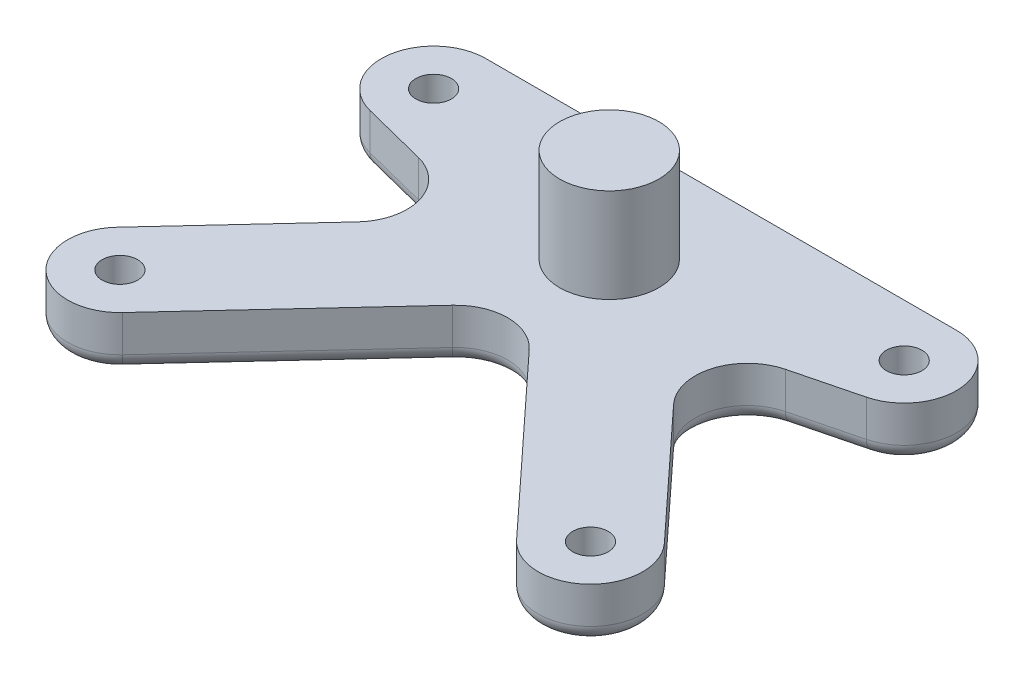
ISO-10303-21;
HEADER;
FILE_DESCRIPTION(('STEP AP214'),'2;1');
FILE_NAME('part.step','',(''),(''),'','','');
FILE_SCHEMA(('AUTOMOTIVE_DESIGN { 1 0 10303 214 1 1 1 1 }'));
ENDSEC;
DATA;
#1=APPLICATION_CONTEXT('core data for automotive mechanical design processes');
#2=APPLICATION_PROTOCOL_DEFINITION('international standard','automotive_design',2000,#1);
#3=PRODUCT_CONTEXT('',#1,'mechanical');
#4=PRODUCT('Part','Part','',(#3));
#5=PRODUCT_RELATED_PRODUCT_CATEGORY('part','',(#4));
#6=PRODUCT_DEFINITION_FORMATION('','',#4);
#7=PRODUCT_DEFINITION_CONTEXT('part definition',#1,'design');
#8=PRODUCT_DEFINITION('design','',#6,#7);
#9=PRODUCT_DEFINITION_SHAPE('','',#8);
#10=(LENGTH_UNIT() NAMED_UNIT(*) SI_UNIT(.MILLI.,.METRE.));
#11=(NAMED_UNIT(*) PLANE_ANGLE_UNIT() SI_UNIT($,.RADIAN.));
#12=(NAMED_UNIT(*) SI_UNIT($,.STERADIAN.) SOLID_ANGLE_UNIT());
#13=UNCERTAINTY_MEASURE_WITH_UNIT(LENGTH_MEASURE(1.E-05),#10,'distance_accuracy_value','');
#14=(GEOMETRIC_REPRESENTATION_CONTEXT(3) GLOBAL_UNCERTAINTY_ASSIGNED_CONTEXT((#13)) GLOBAL_UNIT_ASSIGNED_CONTEXT((#10,
#11,#12)) REPRESENTATION_CONTEXT('',''));
#15=CARTESIAN_POINT('',(0.,0.,0.));
#16=DIRECTION('',(0.,0.,1.));
#17=DIRECTION('',(1.,0.,0.));
#18=AXIS2_PLACEMENT_3D('',#15,#16,#17);
#19=CARTESIAN_POINT('',(-22.5,5.,15.));
#20=DIRECTION('',(0.,1.,0.));
#21=DIRECTION('',(0.,0.,1.));
#22=AXIS2_PLACEMENT_3D('',#19,#20,#21);
#23=PLANE('',#22);
#24=CARTESIAN_POINT('',(0.,5.,-9.3));
#25=DIRECTION('',(0.,1.,0.));
#26=DIRECTION('',(0.,0.,1.));
#27=AXIS2_PLACEMENT_3D('',#24,#25,#26);
#28=CIRCLE('',#27,4.75);
#29=CARTESIAN_POINT('',(0.,5.,-4.55));
#30=VERTEX_POINT('',#29);
#31=EDGE_CURVE('E306',#30,#30,#28,.T.);
#32=ORIENTED_EDGE('',*,*,#31,.F.);
#33=EDGE_LOOP('',(#32));
#34=FACE_BOUND('',#33,.T.);
#35=CARTESIAN_POINT('',(-22.5,5.,-15.));
#36=DIRECTION('',(0.,1.,0.));
#37=DIRECTION('',(0.,0.,1.));
#38=AXIS2_PLACEMENT_3D('',#35,#36,#37);
#39=CIRCLE('',#38,1.7);
#40=CARTESIAN_POINT('',(-22.5,5.,-13.3));
#41=VERTEX_POINT('',#40);
#42=EDGE_CURVE('E326',#41,#41,#39,.T.);
#43=ORIENTED_EDGE('',*,*,#42,.F.);
#44=EDGE_LOOP('',(#43));
#45=FACE_BOUND('',#44,.T.);
#46=CARTESIAN_POINT('',(22.5,5.,-15.));
#47=DIRECTION('',(0.,1.,0.));
#48=DIRECTION('',(0.,0.,1.));
#49=AXIS2_PLACEMENT_3D('',#46,#47,#48);
#50=CIRCLE('',#49,1.69999999999999);
#51=CARTESIAN_POINT('',(22.5,5.,-13.3));
#52=VERTEX_POINT('',#51);
#53=EDGE_CURVE('E203',#52,#52,#50,.T.);
#54=ORIENTED_EDGE('',*,*,#53,.F.);
#55=EDGE_LOOP('',(#54));
#56=FACE_BOUND('',#55,.T.);
#57=CARTESIAN_POINT('',(-22.5,5.,15.));
#58=DIRECTION('',(0.,1.,0.));
#59=DIRECTION('',(0.,0.,1.));
#60=AXIS2_PLACEMENT_3D('',#57,#58,#59);
#61=CIRCLE('',#60,5.00000000000001);
#62=CARTESIAN_POINT('',(-26.1688033700915,5.,11.6029598425089));
#63=VERTEX_POINT('',#62);
#64=CARTESIAN_POINT('',(-18.8311966299096,5.,18.3970401574917));
#65=VERTEX_POINT('',#64);
#66=EDGE_CURVE('E194',#63,#65,#61,.T.);
#67=ORIENTED_EDGE('',*,*,#66,.T.);
#68=DIRECTION('',(0.679408031498311,0.,-0.733760674018164));
#69=VECTOR('',#68,1.);
#70=CARTESIAN_POINT('',(-18.8311966299096,5.,18.3970401574917));
#71=LINE('',#70,#69);
#72=CARTESIAN_POINT('',(-3.66880337009109,5.,2.02165543688799));
#73=VERTEX_POINT('',#72);
#74=EDGE_CURVE('E183',#65,#73,#71,.T.);
#75=ORIENTED_EDGE('',*,*,#74,.T.);
#76=CARTESIAN_POINT('',(0.,5.,5.41869559437926));
#77=DIRECTION('',(0.,-1.,0.));
#78=DIRECTION('',(0.,0.,1.));
#79=AXIS2_PLACEMENT_3D('',#76,#77,#78);
#80=CIRCLE('',#79,5.);
#81=CARTESIAN_POINT('',(3.66880337009086,5.,2.02165543688777));
#82=VERTEX_POINT('',#81);
#83=EDGE_CURVE('E193',#73,#82,#80,.T.);
#84=ORIENTED_EDGE('',*,*,#83,.T.);
#85=DIRECTION('',(0.679408031498305,0.,0.733760674018169));
#86=VECTOR('',#85,1.);
#87=CARTESIAN_POINT('',(3.66880337009086,5.,2.02165543688777));
#88=LINE('',#87,#86);
#89=CARTESIAN_POINT('',(18.8311966299092,5.,18.3970401574915));
#90=VERTEX_POINT('',#89);
#91=EDGE_CURVE('E343',#82,#90,#88,.T.);
#92=ORIENTED_EDGE('',*,*,#91,.T.);
#93=CARTESIAN_POINT('',(22.5,5.,15.));
#94=DIRECTION('',(0.,1.,0.));
#95=DIRECTION('',(0.,0.,1.));
#96=AXIS2_PLACEMENT_3D('',#93,#94,#95);
#97=CIRCLE('',#96,5.);
#98=CARTESIAN_POINT('',(26.1688033700909,5.,11.6029598425085));
#99=VERTEX_POINT('',#98);
#100=EDGE_CURVE('E345',#90,#99,#97,.T.);
#101=ORIENTED_EDGE('',*,*,#100,.T.);
#102=DIRECTION('',(-0.679408031498341,0.,-0.733760674018136));
#103=VECTOR('',#102,1.);
#104=CARTESIAN_POINT('',(15.1071427792466,5.,-0.343633595602185));
#105=LINE('',#104,#103);
#106=CARTESIAN_POINT('',(15.1071427792465,5.,-0.34363359560214));
#107=VERTEX_POINT('',#106);
#108=EDGE_CURVE('E347',#99,#107,#105,.T.);
#109=ORIENTED_EDGE('',*,*,#108,.T.);
#110=CARTESIAN_POINT('',(18.7759461493373,5.,-3.74067375309363));
#111=DIRECTION('',(0.,-1.,0.));
#112=DIRECTION('',(0.,0.,-1.));
#113=AXIS2_PLACEMENT_3D('',#110,#111,#112);
#114=CIRCLE('',#113,4.99999999999995);
#115=CARTESIAN_POINT('',(17.5480680619874,5.,-8.58756094000093));
#116=VERTEX_POINT('',#115);
#117=EDGE_CURVE('E349',#107,#116,#114,.T.);
#118=ORIENTED_EDGE('',*,*,#117,.T.);
#119=DIRECTION('',(0.969377437381459,0.,-0.245575617469966));
#120=VECTOR('',#119,1.);
#121=CARTESIAN_POINT('',(23.7278780873499,5.,-10.1531128130927));
#122=LINE('',#121,#120);
#123=CARTESIAN_POINT('',(23.7278780873499,5.,-10.1531128130927));
#124=VERTEX_POINT('',#123);
#125=EDGE_CURVE('E351',#116,#124,#122,.T.);
#126=ORIENTED_EDGE('',*,*,#125,.T.);
#127=CARTESIAN_POINT('',(22.5,5.,-15.));
#128=DIRECTION('',(0.,1.,0.));
#129=DIRECTION('',(0.,0.,1.));
#130=AXIS2_PLACEMENT_3D('',#127,#128,#129);
#131=CIRCLE('',#130,5.);
#132=CARTESIAN_POINT('',(22.5,5.,-20.));
#133=VERTEX_POINT('',#132);
#134=EDGE_CURVE('E353',#124,#133,#131,.T.);
#135=ORIENTED_EDGE('',*,*,#134,.T.);
#136=DIRECTION('',(-1.,0.,0.));
#137=VECTOR('',#136,1.);
#138=CARTESIAN_POINT('',(-22.5,5.,-20.));
#139=LINE('',#138,#137);
#140=CARTESIAN_POINT('',(-22.5,5.,-20.));
#141=VERTEX_POINT('',#140);
#142=EDGE_CURVE('E355',#133,#141,#139,.T.);
#143=ORIENTED_EDGE('',*,*,#142,.T.);
#144=CARTESIAN_POINT('',(-22.5,5.,-15.));
#145=DIRECTION('',(0.,1.,0.));
#146=DIRECTION('',(0.,0.,1.));
#147=AXIS2_PLACEMENT_3D('',#144,#145,#146);
#148=CIRCLE('',#147,5.);
#149=CARTESIAN_POINT('',(-23.7278780873506,5.,-10.1531128130929));
#150=VERTEX_POINT('',#149);
#151=EDGE_CURVE('E357',#141,#150,#148,.T.);
#152=ORIENTED_EDGE('',*,*,#151,.T.);
#153=DIRECTION('',(0.969377437381453,0.,0.245575617469989));
#154=VECTOR('',#153,1.);
#155=CARTESIAN_POINT('',(-23.7278780873506,5.,-10.1531128130929));
#156=LINE('',#155,#154);
#157=CARTESIAN_POINT('',(-17.5480680619892,5.,-8.58756094000132));
#158=VERTEX_POINT('',#157);
#159=EDGE_CURVE('E359',#150,#158,#156,.T.);
#160=ORIENTED_EDGE('',*,*,#159,.T.);
#161=CARTESIAN_POINT('',(-18.7759461493394,5.,-3.74067375309387));
#162=DIRECTION('',(0.,-1.,0.));
#163=DIRECTION('',(0.,0.,1.));
#164=AXIS2_PLACEMENT_3D('',#161,#162,#163);
#165=CIRCLE('',#164,5.00000000000022);
#166=CARTESIAN_POINT('',(-15.107142779248,5.,-0.343633595602444));
#167=VERTEX_POINT('',#166);
#168=EDGE_CURVE('E361',#158,#167,#165,.T.);
#169=ORIENTED_EDGE('',*,*,#168,.T.);
#170=DIRECTION('',(-0.679408031498295,0.,0.733760674018178));
#171=VECTOR('',#170,1.);
#172=CARTESIAN_POINT('',(-26.1688033700915,5.,11.6029598425089));
#173=LINE('',#172,#171);
#174=EDGE_CURVE('E199',#167,#63,#173,.T.);
#175=ORIENTED_EDGE('',*,*,#174,.T.);
#176=EDGE_LOOP('',(#67,#75,#84,#92,#101,#109,#118,#126,#135,#143,#152,#160,#169,#175));
#177=FACE_BOUND('',#176,.T.);
#178=CARTESIAN_POINT('',(22.5,5.,15.));
#179=DIRECTION('',(0.,1.,0.));
#180=DIRECTION('',(0.,0.,1.));
#181=AXIS2_PLACEMENT_3D('',#178,#179,#180);
#182=CIRCLE('',#181,1.7);
#183=CARTESIAN_POINT('',(22.5,5.,16.7));
#184=VERTEX_POINT('',#183);
#185=EDGE_CURVE('E332',#184,#184,#182,.T.);
#186=ORIENTED_EDGE('',*,*,#185,.F.);
#187=EDGE_LOOP('',(#186));
#188=FACE_BOUND('',#187,.T.);
#189=CARTESIAN_POINT('',(-22.5,5.,15.));
#190=DIRECTION('',(0.,1.,0.));
#191=DIRECTION('',(0.,0.,1.));
#192=AXIS2_PLACEMENT_3D('',#189,#190,#191);
#193=CIRCLE('',#192,1.7);
#194=CARTESIAN_POINT('',(-22.5,5.,16.7));
#195=VERTEX_POINT('',#194);
#196=EDGE_CURVE('E320',#195,#195,#193,.T.);
#197=ORIENTED_EDGE('',*,*,#196,.F.);
#198=EDGE_LOOP('',(#197));
#199=FACE_BOUND('',#198,.T.);
#200=ADVANCED_FACE('F38',(#34,#45,#56,#177,#188,#199),#23,.T.);
#201=CARTESIAN_POINT('',(-22.5,0.,15.));
#202=DIRECTION('',(0.,1.,0.));
#203=DIRECTION('',(0.,0.,1.));
#204=AXIS2_PLACEMENT_3D('',#201,#202,#203);
#205=PLANE('',#204);
#206=DIRECTION('',(-1.,0.,0.));
#207=VECTOR('',#206,1.);
#208=CARTESIAN_POINT('',(-22.5,0.,-18.5));
#209=LINE('',#208,#207);
#210=CARTESIAN_POINT('',(-22.5,0.,-18.5));
#211=VERTEX_POINT('',#210);
#212=CARTESIAN_POINT('',(22.5,0.,-18.5));
#213=VERTEX_POINT('',#212);
#214=EDGE_CURVE('E211',#211,#213,#209,.F.);
#215=ORIENTED_EDGE('',*,*,#214,.T.);
#216=CARTESIAN_POINT('',(22.5,0.,-15.));
#217=DIRECTION('',(0.,1.,0.));
#218=DIRECTION('',(0.,0.,1.));
#219=AXIS2_PLACEMENT_3D('',#216,#217,#218);
#220=CIRCLE('',#219,3.5);
#221=CARTESIAN_POINT('',(23.3595146611449,0.,-11.6071789691649));
#222=VERTEX_POINT('',#221);
#223=EDGE_CURVE('E242',#213,#222,#220,.F.);
#224=ORIENTED_EDGE('',*,*,#223,.T.);
#225=DIRECTION('',(0.969377437381459,0.,-0.245575617469966));
#226=VECTOR('',#225,1.);
#227=CARTESIAN_POINT('',(-26.0683169459383,0.,0.914538371295966));
#228=LINE('',#227,#226);
#229=CARTESIAN_POINT('',(17.1797046357825,0.,-10.0416270960731));
#230=VERTEX_POINT('',#229);
#231=EDGE_CURVE('E240',#222,#230,#228,.F.);
#232=ORIENTED_EDGE('',*,*,#231,.T.);
#233=CARTESIAN_POINT('',(18.7759461493373,0.,-3.74067375309363));
#234=DIRECTION('',(0.,1.,0.));
#235=DIRECTION('',(0.,0.,1.));
#236=AXIS2_PLACEMENT_3D('',#233,#234,#235);
#237=CIRCLE('',#236,6.49999999999995);
#238=CARTESIAN_POINT('',(14.0065017682193,0.,0.675478451645273));
#239=VERTEX_POINT('',#238);
#240=EDGE_CURVE('E238',#230,#239,#237,.T.);
#241=ORIENTED_EDGE('',*,*,#240,.T.);
#242=DIRECTION('',(-0.679408031498341,0.,-0.733760674018136));
#243=VECTOR('',#242,1.);
#244=CARTESIAN_POINT('',(4.29637506216319,0.,-9.8114583908943));
#245=LINE('',#244,#243);
#246=CARTESIAN_POINT('',(25.0681623590636,0.,12.622071889756));
#247=VERTEX_POINT('',#246);
#248=EDGE_CURVE('E236',#239,#247,#245,.F.);
#249=ORIENTED_EDGE('',*,*,#248,.T.);
#250=CARTESIAN_POINT('',(22.5,0.,15.));
#251=DIRECTION('',(0.,1.,0.));
#252=DIRECTION('',(0.,0.,1.));
#253=AXIS2_PLACEMENT_3D('',#250,#251,#252);
#254=CIRCLE('',#253,3.5);
#255=CARTESIAN_POINT('',(19.9318376409364,0.,17.3779281102441));
#256=VERTEX_POINT('',#255);
#257=EDGE_CURVE('E234',#247,#256,#254,.F.);
#258=ORIENTED_EDGE('',*,*,#257,.T.);
#259=DIRECTION('',(0.679408031498305,0.,0.733760674018169));
#260=VECTOR('',#259,1.);
#261=CARTESIAN_POINT('',(-0.839949655961663,0.,-5.05560217040586));
#262=LINE('',#261,#260);
#263=CARTESIAN_POINT('',(4.76944438111811,0.,1.00254338964031));
#264=VERTEX_POINT('',#263);
#265=EDGE_CURVE('E232',#256,#264,#262,.F.);
#266=ORIENTED_EDGE('',*,*,#265,.T.);
#267=CARTESIAN_POINT('',(0.,0.,5.41869559437926));
#268=DIRECTION('',(0.,1.,0.));
#269=DIRECTION('',(0.,0.,1.));
#270=AXIS2_PLACEMENT_3D('',#267,#268,#269);
#271=CIRCLE('',#270,6.5);
#272=CARTESIAN_POINT('',(-4.76944438111841,0.,1.00254338964061));
#273=VERTEX_POINT('',#272);
#274=EDGE_CURVE('E230',#264,#273,#271,.T.);
#275=ORIENTED_EDGE('',*,*,#274,.T.);
#276=DIRECTION('',(0.679408031498311,0.,-0.733760674018164));
#277=VECTOR('',#276,1.);
#278=CARTESIAN_POINT('',(-19.9318376409366,0.,17.377928110244));
#279=LINE('',#278,#277);
#280=CARTESIAN_POINT('',(-19.9318376409367,0.,17.3779281102444));
#281=VERTEX_POINT('',#280);
#282=EDGE_CURVE('E228',#273,#281,#279,.F.);
#283=ORIENTED_EDGE('',*,*,#282,.T.);
#284=CARTESIAN_POINT('',(-22.5,0.,15.));
#285=DIRECTION('',(0.,1.,0.));
#286=DIRECTION('',(0.,0.,1.));
#287=AXIS2_PLACEMENT_3D('',#284,#285,#286);
#288=CIRCLE('',#287,3.50000000000001);
#289=CARTESIAN_POINT('',(-25.0681623590641,0.,12.6220718897561));
#290=VERTEX_POINT('',#289);
#291=EDGE_CURVE('E226',#281,#290,#288,.F.);
#292=ORIENTED_EDGE('',*,*,#291,.T.);
#293=DIRECTION('',(-0.679408031498295,0.,0.733760674018179));
#294=VECTOR('',#293,1.);
#295=CARTESIAN_POINT('',(-25.0681623590638,0.,12.6220718897558));
#296=LINE('',#295,#294);
#297=CARTESIAN_POINT('',(-14.0065017682208,0.,0.675478451644933));
#298=VERTEX_POINT('',#297);
#299=EDGE_CURVE('E224',#290,#298,#296,.F.);
#300=ORIENTED_EDGE('',*,*,#299,.T.);
#301=CARTESIAN_POINT('',(-18.7759461493394,0.,-3.74067375309387));
#302=DIRECTION('',(0.,1.,0.));
#303=DIRECTION('',(0.,0.,1.));
#304=AXIS2_PLACEMENT_3D('',#301,#302,#303);
#305=CIRCLE('',#304,6.50000000000022);
#306=CARTESIAN_POINT('',(-17.1797046357842,0.,-10.0416270960734));
#307=VERTEX_POINT('',#306);
#308=EDGE_CURVE('E222',#298,#307,#305,.T.);
#309=ORIENTED_EDGE('',*,*,#308,.T.);
#310=DIRECTION('',(0.969377437381454,0.,0.245575617469989));
#311=VECTOR('',#310,1.);
#312=CARTESIAN_POINT('',(-16.2178507787522,0.,-9.79795745229192));
#313=LINE('',#312,#311);
#314=CARTESIAN_POINT('',(-23.3595146611456,0.,-11.6071789691651));
#315=VERTEX_POINT('',#314);
#316=EDGE_CURVE('E220',#307,#315,#313,.F.);
#317=ORIENTED_EDGE('',*,*,#316,.T.);
#318=CARTESIAN_POINT('',(-22.5,0.,-15.));
#319=DIRECTION('',(0.,1.,0.));
#320=DIRECTION('',(0.,0.,1.));
#321=AXIS2_PLACEMENT_3D('',#318,#319,#320);
#322=CIRCLE('',#321,3.5);
#323=EDGE_CURVE('E218',#315,#211,#322,.F.);
#324=ORIENTED_EDGE('',*,*,#323,.T.);
#325=EDGE_LOOP('',(#215,#224,#232,#241,#249,#258,#266,#275,#283,#292,#300,#309,#317,#324));
#326=FACE_BOUND('',#325,.T.);
#327=CARTESIAN_POINT('',(22.5,0.,-15.));
#328=DIRECTION('',(0.,1.,0.));
#329=DIRECTION('',(0.,0.,1.));
#330=AXIS2_PLACEMENT_3D('',#327,#328,#329);
#331=CIRCLE('',#330,1.69999999999999);
#332=CARTESIAN_POINT('',(22.5,0.,-13.3));
#333=VERTEX_POINT('',#332);
#334=EDGE_CURVE('E335',#333,#333,#331,.T.);
#335=ORIENTED_EDGE('',*,*,#334,.T.);
#336=EDGE_LOOP('',(#335));
#337=FACE_BOUND('',#336,.T.);
#338=CARTESIAN_POINT('',(22.5,0.,15.));
#339=DIRECTION('',(0.,1.,0.));
#340=DIRECTION('',(0.,0.,1.));
#341=AXIS2_PLACEMENT_3D('',#338,#339,#340);
#342=CIRCLE('',#341,1.7);
#343=CARTESIAN_POINT('',(22.5,0.,16.7));
#344=VERTEX_POINT('',#343);
#345=EDGE_CURVE('E329',#344,#344,#342,.T.);
#346=ORIENTED_EDGE('',*,*,#345,.T.);
#347=EDGE_LOOP('',(#346));
#348=FACE_BOUND('',#347,.T.);
#349=CARTESIAN_POINT('',(-22.5,0.,-15.));
#350=DIRECTION('',(0.,1.,0.));
#351=DIRECTION('',(0.,0.,1.));
#352=AXIS2_PLACEMENT_3D('',#349,#350,#351);
#353=CIRCLE('',#352,1.7);
#354=CARTESIAN_POINT('',(-22.5,0.,-13.3));
#355=VERTEX_POINT('',#354);
#356=EDGE_CURVE('E323',#355,#355,#353,.T.);
#357=ORIENTED_EDGE('',*,*,#356,.T.);
#358=EDGE_LOOP('',(#357));
#359=FACE_BOUND('',#358,.T.);
#360=CARTESIAN_POINT('',(-22.5,0.,15.));
#361=DIRECTION('',(0.,1.,0.));
#362=DIRECTION('',(0.,0.,1.));
#363=AXIS2_PLACEMENT_3D('',#360,#361,#362);
#364=CIRCLE('',#363,1.7);
#365=CARTESIAN_POINT('',(-22.5,0.,16.7));
#366=VERTEX_POINT('',#365);
#367=EDGE_CURVE('E317',#366,#366,#364,.T.);
#368=ORIENTED_EDGE('',*,*,#367,.T.);
#369=EDGE_LOOP('',(#368));
#370=FACE_BOUND('',#369,.T.);
#371=ADVANCED_FACE('F426',(#326,#337,#348,#359,#370),#205,.F.);
#372=CARTESIAN_POINT('',(-22.5,5.,15.));
#373=DIRECTION('',(0.,-1.,0.));
#374=DIRECTION('',(0.,0.,-1.));
#375=AXIS2_PLACEMENT_3D('',#372,#373,#374);
#376=CYLINDRICAL_SURFACE('',#375,5.00000000000001);
#377=DIRECTION('',(0.,-1.,0.));
#378=VECTOR('',#377,1.);
#379=CARTESIAN_POINT('',(-26.1688033700915,5.,11.6029598425089));
#380=LINE('',#379,#378);
#381=CARTESIAN_POINT('',(-26.1688033700915,1.5,11.6029598425089));
#382=VERTEX_POINT('',#381);
#383=EDGE_CURVE('E364',#63,#382,#380,.T.);
#384=ORIENTED_EDGE('',*,*,#383,.T.);
#385=CARTESIAN_POINT('',(-22.5,1.5,15.));
#386=DIRECTION('',(0.,1.,0.));
#387=DIRECTION('',(0.,0.,1.));
#388=AXIS2_PLACEMENT_3D('',#385,#386,#387);
#389=CIRCLE('',#388,5.00000000000001);
#390=CARTESIAN_POINT('',(-18.8311966299096,1.5,18.3970401574917));
#391=VERTEX_POINT('',#390);
#392=EDGE_CURVE('E207',#382,#391,#389,.T.);
#393=ORIENTED_EDGE('',*,*,#392,.T.);
#394=DIRECTION('',(0.,-1.,0.));
#395=VECTOR('',#394,1.);
#396=CARTESIAN_POINT('',(-18.8311966299096,5.,18.3970401574917));
#397=LINE('',#396,#395);
#398=EDGE_CURVE('E187',#65,#391,#397,.T.);
#399=ORIENTED_EDGE('',*,*,#398,.F.);
#400=ORIENTED_EDGE('',*,*,#66,.F.);
#401=EDGE_LOOP('',(#384,#393,#399,#400));
#402=FACE_BOUND('',#401,.T.);
#403=ADVANCED_FACE('F205',(#402),#376,.T.);
#404=CARTESIAN_POINT('',(-18.8311966299096,5.,18.3970401574917));
#405=DIRECTION('',(-0.733760674018164,0.,-0.679408031498311));
#406=DIRECTION('',(-0.679408031498311,0.,0.733760674018164));
#407=AXIS2_PLACEMENT_3D('',#404,#405,#406);
#408=PLANE('',#407);
#409=ORIENTED_EDGE('',*,*,#398,.T.);
#410=DIRECTION('',(0.679408031498311,0.,-0.733760674018164));
#411=VECTOR('',#410,1.);
#412=CARTESIAN_POINT('',(-18.8311966299096,1.5,18.3970401574917));
#413=LINE('',#412,#411);
#414=CARTESIAN_POINT('',(-3.66880337009109,1.5,2.02165543688799));
#415=VERTEX_POINT('',#414);
#416=EDGE_CURVE('E257',#391,#415,#413,.T.);
#417=ORIENTED_EDGE('',*,*,#416,.T.);
#418=DIRECTION('',(0.,-1.,0.));
#419=VECTOR('',#418,1.);
#420=CARTESIAN_POINT('',(-3.66880337009109,5.,2.02165543688799));
#421=LINE('',#420,#419);
#422=EDGE_CURVE('E190',#73,#415,#421,.T.);
#423=ORIENTED_EDGE('',*,*,#422,.F.);
#424=ORIENTED_EDGE('',*,*,#74,.F.);
#425=EDGE_LOOP('',(#409,#417,#423,#424));
#426=FACE_BOUND('',#425,.T.);
#427=ADVANCED_FACE('F185',(#426),#408,.F.);
#428=CARTESIAN_POINT('',(0.,5.,5.41869559437926));
#429=DIRECTION('',(0.,-1.,0.));
#430=DIRECTION('',(0.,0.,-1.));
#431=AXIS2_PLACEMENT_3D('',#428,#429,#430);
#432=CYLINDRICAL_SURFACE('',#431,5.);
#433=ORIENTED_EDGE('',*,*,#422,.T.);
#434=CARTESIAN_POINT('',(0.,1.5,5.41869559437926));
#435=DIRECTION('',(0.,1.,0.));
#436=DIRECTION('',(0.,0.,1.));
#437=AXIS2_PLACEMENT_3D('',#434,#435,#436);
#438=CIRCLE('',#437,5.);
#439=CARTESIAN_POINT('',(3.66880337009086,1.5,2.02165543688777));
#440=VERTEX_POINT('',#439);
#441=EDGE_CURVE('E255',#415,#440,#438,.F.);
#442=ORIENTED_EDGE('',*,*,#441,.T.);
#443=DIRECTION('',(0.,-1.,0.));
#444=VECTOR('',#443,1.);
#445=CARTESIAN_POINT('',(3.66880337009086,5.,2.02165543688777));
#446=LINE('',#445,#444);
#447=EDGE_CURVE('E213',#82,#440,#446,.T.);
#448=ORIENTED_EDGE('',*,*,#447,.F.);
#449=ORIENTED_EDGE('',*,*,#83,.F.);
#450=EDGE_LOOP('',(#433,#442,#448,#449));
#451=FACE_BOUND('',#450,.T.);
#452=ADVANCED_FACE('F422',(#451),#432,.F.);
#453=CARTESIAN_POINT('',(3.66880337009086,5.,2.02165543688777));
#454=DIRECTION('',(0.733760674018169,0.,-0.679408031498305));
#455=DIRECTION('',(-0.679408031498305,0.,-0.733760674018169));
#456=AXIS2_PLACEMENT_3D('',#453,#454,#455);
#457=PLANE('',#456);
#458=ORIENTED_EDGE('',*,*,#447,.T.);
#459=DIRECTION('',(0.679408031498305,0.,0.733760674018169));
#460=VECTOR('',#459,1.);
#461=CARTESIAN_POINT('',(3.66880337009086,1.5,2.02165543688777));
#462=LINE('',#461,#460);
#463=CARTESIAN_POINT('',(18.8311966299092,1.5,18.3970401574915));
#464=VERTEX_POINT('',#463);
#465=EDGE_CURVE('E253',#440,#464,#462,.T.);
#466=ORIENTED_EDGE('',*,*,#465,.T.);
#467=DIRECTION('',(0.,-1.,0.));
#468=VECTOR('',#467,1.);
#469=CARTESIAN_POINT('',(18.8311966299092,5.,18.3970401574915));
#470=LINE('',#469,#468);
#471=EDGE_CURVE('E390',#90,#464,#470,.T.);
#472=ORIENTED_EDGE('',*,*,#471,.F.);
#473=ORIENTED_EDGE('',*,*,#91,.F.);
#474=EDGE_LOOP('',(#458,#466,#472,#473));
#475=FACE_BOUND('',#474,.T.);
#476=ADVANCED_FACE('F397',(#475),#457,.F.);
#477=CARTESIAN_POINT('',(22.5,5.,15.));
#478=DIRECTION('',(0.,-1.,0.));
#479=DIRECTION('',(0.,0.,-1.));
#480=AXIS2_PLACEMENT_3D('',#477,#478,#479);
#481=CYLINDRICAL_SURFACE('',#480,5.);
#482=ORIENTED_EDGE('',*,*,#471,.T.);
#483=CARTESIAN_POINT('',(22.5,1.5,15.));
#484=DIRECTION('',(0.,1.,0.));
#485=DIRECTION('',(0.,0.,1.));
#486=AXIS2_PLACEMENT_3D('',#483,#484,#485);
#487=CIRCLE('',#486,5.);
#488=CARTESIAN_POINT('',(26.1688033700909,1.5,11.6029598425085));
#489=VERTEX_POINT('',#488);
#490=EDGE_CURVE('E251',#464,#489,#487,.T.);
#491=ORIENTED_EDGE('',*,*,#490,.T.);
#492=DIRECTION('',(0.,-1.,0.));
#493=VECTOR('',#492,1.);
#494=CARTESIAN_POINT('',(26.1688033700909,5.,11.6029598425085));
#495=LINE('',#494,#493);
#496=EDGE_CURVE('E387',#99,#489,#495,.T.);
#497=ORIENTED_EDGE('',*,*,#496,.F.);
#498=ORIENTED_EDGE('',*,*,#100,.F.);
#499=EDGE_LOOP('',(#482,#491,#497,#498));
#500=FACE_BOUND('',#499,.T.);
#501=ADVANCED_FACE('F414',(#500),#481,.T.);
#502=CARTESIAN_POINT('',(15.1071427792466,5.,-0.343633595602185));
#503=DIRECTION('',(-0.733760674018136,0.,0.679408031498341));
#504=DIRECTION('',(0.679408031498341,0.,0.733760674018136));
#505=AXIS2_PLACEMENT_3D('',#502,#503,#504);
#506=PLANE('',#505);
#507=ORIENTED_EDGE('',*,*,#496,.T.);
#508=DIRECTION('',(-0.679408031498341,0.,-0.733760674018136));
#509=VECTOR('',#508,1.);
#510=CARTESIAN_POINT('',(15.1071427792466,1.5,-0.343633595602185));
#511=LINE('',#510,#509);
#512=CARTESIAN_POINT('',(15.1071427792465,1.5,-0.34363359560214));
#513=VERTEX_POINT('',#512);
#514=EDGE_CURVE('E249',#489,#513,#511,.T.);
#515=ORIENTED_EDGE('',*,*,#514,.T.);
#516=DIRECTION('',(0.,-1.,0.));
#517=VECTOR('',#516,1.);
#518=CARTESIAN_POINT('',(15.1071427792465,5.,-0.34363359560214));
#519=LINE('',#518,#517);
#520=EDGE_CURVE('E384',#107,#513,#519,.T.);
#521=ORIENTED_EDGE('',*,*,#520,.F.);
#522=ORIENTED_EDGE('',*,*,#108,.F.);
#523=EDGE_LOOP('',(#507,#515,#521,#522));
#524=FACE_BOUND('',#523,.T.);
#525=ADVANCED_FACE('F418',(#524),#506,.F.);
#526=CARTESIAN_POINT('',(18.7759461493373,5.,-3.74067375309363));
#527=DIRECTION('',(0.,-1.,0.));
#528=DIRECTION('',(0.,0.,-1.));
#529=AXIS2_PLACEMENT_3D('',#526,#527,#528);
#530=CYLINDRICAL_SURFACE('',#529,4.99999999999995);
#531=ORIENTED_EDGE('',*,*,#520,.T.);
#532=CARTESIAN_POINT('',(18.7759461493373,1.5,-3.74067375309363));
#533=DIRECTION('',(0.,1.,0.));
#534=DIRECTION('',(0.,0.,1.));
#535=AXIS2_PLACEMENT_3D('',#532,#533,#534);
#536=CIRCLE('',#535,4.99999999999995);
#537=CARTESIAN_POINT('',(17.5480680619874,1.5,-8.58756094000093));
#538=VERTEX_POINT('',#537);
#539=EDGE_CURVE('E247',#513,#538,#536,.F.);
#540=ORIENTED_EDGE('',*,*,#539,.T.);
#541=DIRECTION('',(0.,-1.,0.));
#542=VECTOR('',#541,1.);
#543=CARTESIAN_POINT('',(17.5480680619874,5.,-8.58756094000093));
#544=LINE('',#543,#542);
#545=EDGE_CURVE('E381',#116,#538,#544,.T.);
#546=ORIENTED_EDGE('',*,*,#545,.F.);
#547=ORIENTED_EDGE('',*,*,#117,.F.);
#548=EDGE_LOOP('',(#531,#540,#546,#547));
#549=FACE_BOUND('',#548,.T.);
#550=ADVANCED_FACE('F440',(#549),#530,.F.);
#551=CARTESIAN_POINT('',(23.7278780873499,5.,-10.1531128130927));
#552=DIRECTION('',(-0.245575617469966,0.,-0.969377437381459));
#553=DIRECTION('',(-0.969377437381459,0.,0.245575617469966));
#554=AXIS2_PLACEMENT_3D('',#551,#552,#553);
#555=PLANE('',#554);
#556=ORIENTED_EDGE('',*,*,#545,.T.);
#557=DIRECTION('',(0.969377437381459,0.,-0.245575617469966));
#558=VECTOR('',#557,1.);
#559=CARTESIAN_POINT('',(23.7278780873499,1.5,-10.1531128130927));
#560=LINE('',#559,#558);
#561=CARTESIAN_POINT('',(23.7278780873499,1.5,-10.1531128130927));
#562=VERTEX_POINT('',#561);
#563=EDGE_CURVE('E245',#538,#562,#560,.T.);
#564=ORIENTED_EDGE('',*,*,#563,.T.);
#565=DIRECTION('',(0.,-1.,0.));
#566=VECTOR('',#565,1.);
#567=CARTESIAN_POINT('',(23.7278780873499,5.,-10.1531128130927));
#568=LINE('',#567,#566);
#569=EDGE_CURVE('E378',#124,#562,#568,.T.);
#570=ORIENTED_EDGE('',*,*,#569,.F.);
#571=ORIENTED_EDGE('',*,*,#125,.F.);
#572=EDGE_LOOP('',(#556,#564,#570,#571));
#573=FACE_BOUND('',#572,.T.);
#574=ADVANCED_FACE('F443',(#573),#555,.F.);
#575=CARTESIAN_POINT('',(22.5,5.,-15.));
#576=DIRECTION('',(0.,-1.,0.));
#577=DIRECTION('',(0.,0.,-1.));
#578=AXIS2_PLACEMENT_3D('',#575,#576,#577);
#579=CYLINDRICAL_SURFACE('',#578,5.);
#580=ORIENTED_EDGE('',*,*,#569,.T.);
#581=CARTESIAN_POINT('',(22.5,1.5,-15.));
#582=DIRECTION('',(0.,1.,0.));
#583=DIRECTION('',(0.,0.,1.));
#584=AXIS2_PLACEMENT_3D('',#581,#582,#583);
#585=CIRCLE('',#584,5.);
#586=CARTESIAN_POINT('',(22.5,1.5,-20.));
#587=VERTEX_POINT('',#586);
#588=EDGE_CURVE('E208',#562,#587,#585,.T.);
#589=ORIENTED_EDGE('',*,*,#588,.T.);
#590=DIRECTION('',(0.,-1.,0.));
#591=VECTOR('',#590,1.);
#592=CARTESIAN_POINT('',(22.5,5.,-20.));
#593=LINE('',#592,#591);
#594=EDGE_CURVE('E376',#133,#587,#593,.T.);
#595=ORIENTED_EDGE('',*,*,#594,.F.);
#596=ORIENTED_EDGE('',*,*,#134,.F.);
#597=EDGE_LOOP('',(#580,#589,#595,#596));
#598=FACE_BOUND('',#597,.T.);
#599=ADVANCED_FACE('F449',(#598),#579,.T.);
#600=CARTESIAN_POINT('',(-22.5,5.,-20.));
#601=DIRECTION('',(0.,0.,1.));
#602=DIRECTION('',(1.,0.,0.));
#603=AXIS2_PLACEMENT_3D('',#600,#601,#602);
#604=PLANE('',#603);
#605=ORIENTED_EDGE('',*,*,#594,.T.);
#606=DIRECTION('',(-1.,0.,0.));
#607=VECTOR('',#606,1.);
#608=CARTESIAN_POINT('',(-22.5,1.5,-20.));
#609=LINE('',#608,#607);
#610=CARTESIAN_POINT('',(-22.5,1.5,-20.));
#611=VERTEX_POINT('',#610);
#612=EDGE_CURVE('E11',#587,#611,#609,.T.);
#613=ORIENTED_EDGE('',*,*,#612,.T.);
#614=DIRECTION('',(0.,-1.,0.));
#615=VECTOR('',#614,1.);
#616=CARTESIAN_POINT('',(-22.5,5.,-20.));
#617=LINE('',#616,#615);
#618=EDGE_CURVE('E374',#141,#611,#617,.T.);
#619=ORIENTED_EDGE('',*,*,#618,.F.);
#620=ORIENTED_EDGE('',*,*,#142,.F.);
#621=EDGE_LOOP('',(#605,#613,#619,#620));
#622=FACE_BOUND('',#621,.T.);
#623=ADVANCED_FACE('F451',(#622),#604,.F.);
#624=CARTESIAN_POINT('',(-22.5,5.,-15.));
#625=DIRECTION('',(0.,-1.,0.));
#626=DIRECTION('',(0.,0.,-1.));
#627=AXIS2_PLACEMENT_3D('',#624,#625,#626);
#628=CYLINDRICAL_SURFACE('',#627,5.);
#629=ORIENTED_EDGE('',*,*,#618,.T.);
#630=CARTESIAN_POINT('',(-22.5,1.5,-15.));
#631=DIRECTION('',(0.,1.,0.));
#632=DIRECTION('',(0.,0.,1.));
#633=AXIS2_PLACEMENT_3D('',#630,#631,#632);
#634=CIRCLE('',#633,5.);
#635=CARTESIAN_POINT('',(-23.7278780873506,1.5,-10.1531128130929));
#636=VERTEX_POINT('',#635);
#637=EDGE_CURVE('E47',#611,#636,#634,.T.);
#638=ORIENTED_EDGE('',*,*,#637,.T.);
#639=DIRECTION('',(0.,-1.,0.));
#640=VECTOR('',#639,1.);
#641=CARTESIAN_POINT('',(-23.7278780873506,5.,-10.1531128130929));
#642=LINE('',#641,#640);
#643=EDGE_CURVE('E372',#150,#636,#642,.T.);
#644=ORIENTED_EDGE('',*,*,#643,.F.);
#645=ORIENTED_EDGE('',*,*,#151,.F.);
#646=EDGE_LOOP('',(#629,#638,#644,#645));
#647=FACE_BOUND('',#646,.T.);
#648=ADVANCED_FACE('F453',(#647),#628,.T.);
#649=CARTESIAN_POINT('',(-23.7278780873506,5.,-10.1531128130929));
#650=DIRECTION('',(0.245575617469989,0.,-0.969377437381454));
#651=DIRECTION('',(-0.969377437381454,0.,-0.245575617469989));
#652=AXIS2_PLACEMENT_3D('',#649,#650,#651);
#653=PLANE('',#652);
#654=ORIENTED_EDGE('',*,*,#643,.T.);
#655=DIRECTION('',(0.969377437381454,0.,0.245575617469989));
#656=VECTOR('',#655,1.);
#657=CARTESIAN_POINT('',(-23.7278780873506,1.5,-10.1531128130929));
#658=LINE('',#657,#656);
#659=CARTESIAN_POINT('',(-17.5480680619892,1.5,-8.58756094000132));
#660=VERTEX_POINT('',#659);
#661=EDGE_CURVE('E264',#636,#660,#658,.T.);
#662=ORIENTED_EDGE('',*,*,#661,.T.);
#663=DIRECTION('',(0.,-1.,0.));
#664=VECTOR('',#663,1.);
#665=CARTESIAN_POINT('',(-17.5480680619892,5.,-8.58756094000132));
#666=LINE('',#665,#664);
#667=EDGE_CURVE('E369',#158,#660,#666,.T.);
#668=ORIENTED_EDGE('',*,*,#667,.F.);
#669=ORIENTED_EDGE('',*,*,#159,.F.);
#670=EDGE_LOOP('',(#654,#662,#668,#669));
#671=FACE_BOUND('',#670,.T.);
#672=ADVANCED_FACE('F459',(#671),#653,.F.);
#673=CARTESIAN_POINT('',(-18.7759461493394,5.,-3.74067375309387));
#674=DIRECTION('',(0.,-1.,0.));
#675=DIRECTION('',(0.,0.,-1.));
#676=AXIS2_PLACEMENT_3D('',#673,#674,#675);
#677=CYLINDRICAL_SURFACE('',#676,5.00000000000022);
#678=ORIENTED_EDGE('',*,*,#667,.T.);
#679=CARTESIAN_POINT('',(-18.7759461493394,1.5,-3.74067375309387));
#680=DIRECTION('',(0.,1.,0.));
#681=DIRECTION('',(0.,0.,1.));
#682=AXIS2_PLACEMENT_3D('',#679,#680,#681);
#683=CIRCLE('',#682,5.00000000000022);
#684=CARTESIAN_POINT('',(-15.107142779248,1.5,-0.343633595602444));
#685=VERTEX_POINT('',#684);
#686=EDGE_CURVE('E262',#660,#685,#683,.F.);
#687=ORIENTED_EDGE('',*,*,#686,.T.);
#688=DIRECTION('',(0.,-1.,0.));
#689=VECTOR('',#688,1.);
#690=CARTESIAN_POINT('',(-15.107142779248,5.,-0.343633595602444));
#691=LINE('',#690,#689);
#692=EDGE_CURVE('E366',#167,#685,#691,.T.);
#693=ORIENTED_EDGE('',*,*,#692,.F.);
#694=ORIENTED_EDGE('',*,*,#168,.F.);
#695=EDGE_LOOP('',(#678,#687,#693,#694));
#696=FACE_BOUND('',#695,.T.);
#697=ADVANCED_FACE('F463',(#696),#677,.F.);
#698=CARTESIAN_POINT('',(-26.1688033700915,5.,11.6029598425089));
#699=DIRECTION('',(0.733760674018178,0.,0.679408031498295));
#700=DIRECTION('',(0.679408031498295,0.,-0.733760674018179));
#701=AXIS2_PLACEMENT_3D('',#698,#699,#700);
#702=PLANE('',#701);
#703=ORIENTED_EDGE('',*,*,#692,.T.);
#704=DIRECTION('',(-0.679408031498295,0.,0.733760674018179));
#705=VECTOR('',#704,1.);
#706=CARTESIAN_POINT('',(-26.1688033700915,1.5,11.6029598425089));
#707=LINE('',#706,#705);
#708=EDGE_CURVE('E260',#685,#382,#707,.T.);
#709=ORIENTED_EDGE('',*,*,#708,.T.);
#710=ORIENTED_EDGE('',*,*,#383,.F.);
#711=ORIENTED_EDGE('',*,*,#174,.F.);
#712=EDGE_LOOP('',(#703,#709,#710,#711));
#713=FACE_BOUND('',#712,.T.);
#714=ADVANCED_FACE('F466',(#713),#702,.F.);
#715=CARTESIAN_POINT('',(22.5,5.,-15.));
#716=DIRECTION('',(0.,-1.,0.));
#717=DIRECTION('',(0.,0.,-1.));
#718=AXIS2_PLACEMENT_3D('',#715,#716,#717);
#719=CYLINDRICAL_SURFACE('',#718,1.69999999999999);
#720=ORIENTED_EDGE('',*,*,#53,.T.);
#721=EDGE_LOOP('',(#720));
#722=FACE_BOUND('',#721,.T.);
#723=ORIENTED_EDGE('',*,*,#334,.F.);
#724=EDGE_LOOP('',(#723));
#725=FACE_BOUND('',#724,.T.);
#726=ADVANCED_FACE('F512',(#722,#725),#719,.F.);
#727=CARTESIAN_POINT('',(22.5,5.,15.));
#728=DIRECTION('',(0.,-1.,0.));
#729=DIRECTION('',(0.,0.,-1.));
#730=AXIS2_PLACEMENT_3D('',#727,#728,#729);
#731=CYLINDRICAL_SURFACE('',#730,1.7);
#732=ORIENTED_EDGE('',*,*,#185,.T.);
#733=EDGE_LOOP('',(#732));
#734=FACE_BOUND('',#733,.T.);
#735=ORIENTED_EDGE('',*,*,#345,.F.);
#736=EDGE_LOOP('',(#735));
#737=FACE_BOUND('',#736,.T.);
#738=ADVANCED_FACE('F605',(#734,#737),#731,.F.);
#739=CARTESIAN_POINT('',(-22.5,5.,-15.));
#740=DIRECTION('',(0.,-1.,0.));
#741=DIRECTION('',(0.,0.,-1.));
#742=AXIS2_PLACEMENT_3D('',#739,#740,#741);
#743=CYLINDRICAL_SURFACE('',#742,1.7);
#744=ORIENTED_EDGE('',*,*,#42,.T.);
#745=EDGE_LOOP('',(#744));
#746=FACE_BOUND('',#745,.T.);
#747=ORIENTED_EDGE('',*,*,#356,.F.);
#748=EDGE_LOOP('',(#747));
#749=FACE_BOUND('',#748,.T.);
#750=ADVANCED_FACE('F612',(#746,#749),#743,.F.);
#751=CARTESIAN_POINT('',(-22.5,5.,15.));
#752=DIRECTION('',(0.,-1.,0.));
#753=DIRECTION('',(0.,0.,-1.));
#754=AXIS2_PLACEMENT_3D('',#751,#752,#753);
#755=CYLINDRICAL_SURFACE('',#754,1.7);
#756=ORIENTED_EDGE('',*,*,#196,.T.);
#757=EDGE_LOOP('',(#756));
#758=FACE_BOUND('',#757,.T.);
#759=ORIENTED_EDGE('',*,*,#367,.F.);
#760=EDGE_LOOP('',(#759));
#761=FACE_BOUND('',#760,.T.);
#762=ADVANCED_FACE('F619',(#758,#761),#755,.F.);
#763=CARTESIAN_POINT('',(0.,14.,-9.3));
#764=DIRECTION('',(0.,-1.,0.));
#765=DIRECTION('',(0.,0.,-1.));
#766=AXIS2_PLACEMENT_3D('',#763,#764,#765);
#767=CYLINDRICAL_SURFACE('',#766,4.75);
#768=CARTESIAN_POINT('',(0.,14.,-9.3));
#769=DIRECTION('',(0.,1.,0.));
#770=DIRECTION('',(0.,0.,1.));
#771=AXIS2_PLACEMENT_3D('',#768,#769,#770);
#772=CIRCLE('',#771,4.75);
#773=CARTESIAN_POINT('',(0.,14.,-4.55));
#774=VERTEX_POINT('',#773);
#775=EDGE_CURVE('E312',#774,#774,#772,.T.);
#776=ORIENTED_EDGE('',*,*,#775,.F.);
#777=EDGE_LOOP('',(#776));
#778=FACE_BOUND('',#777,.T.);
#779=ORIENTED_EDGE('',*,*,#31,.T.);
#780=EDGE_LOOP('',(#779));
#781=FACE_BOUND('',#780,.T.);
#782=ADVANCED_FACE('F627',(#778,#781),#767,.T.);
#783=CARTESIAN_POINT('',(0.,14.,-9.3));
#784=DIRECTION('',(0.,1.,0.));
#785=DIRECTION('',(0.,0.,1.));
#786=AXIS2_PLACEMENT_3D('',#783,#784,#785);
#787=PLANE('',#786);
#788=ORIENTED_EDGE('',*,*,#775,.T.);
#789=EDGE_LOOP('',(#788));
#790=FACE_BOUND('',#789,.T.);
#791=ADVANCED_FACE('F635',(#790),#787,.T.);
#792=CARTESIAN_POINT('',(-19.9318376409368,1.5,17.3779281102442));
#793=DIRECTION('',(0.679408031498311,0.,-0.733760674018164));
#794=DIRECTION('',(-0.733760674018164,0.,-0.679408031498311));
#795=AXIS2_PLACEMENT_3D('',#792,#793,#794);
#796=CYLINDRICAL_SURFACE('',#795,1.5);
#797=CARTESIAN_POINT('',(-19.9318376409368,1.5,17.3779281102442));
#798=DIRECTION('',(-0.679408031498311,0.,0.733760674018164));
#799=DIRECTION('',(0.733760674018164,0.,0.679408031498311));
#800=AXIS2_PLACEMENT_3D('',#797,#798,#799);
#801=CIRCLE('',#800,1.5);
#802=EDGE_CURVE('E300',#281,#391,#801,.T.);
#803=ORIENTED_EDGE('',*,*,#802,.F.);
#804=ORIENTED_EDGE('',*,*,#282,.F.);
#805=CARTESIAN_POINT('',(-4.76944438111833,1.5,1.00254338964052));
#806=DIRECTION('',(0.679408031498311,0.,-0.733760674018164));
#807=DIRECTION('',(-0.733760674018164,0.,-0.679408031498311));
#808=AXIS2_PLACEMENT_3D('',#805,#806,#807);
#809=CIRCLE('',#808,1.5);
#810=EDGE_CURVE('E42',#415,#273,#809,.T.);
#811=ORIENTED_EDGE('',*,*,#810,.F.);
#812=ORIENTED_EDGE('',*,*,#416,.F.);
#813=EDGE_LOOP('',(#803,#804,#811,#812));
#814=FACE_BOUND('',#813,.T.);
#815=ADVANCED_FACE('F40',(#814),#796,.T.);
#816=CARTESIAN_POINT('',(0.,1.5,5.41869559437926));
#817=DIRECTION('',(0.,1.,0.));
#818=DIRECTION('',(0.,0.,1.));
#819=AXIS2_PLACEMENT_3D('',#816,#817,#818);
#820=TOROIDAL_SURFACE('',#819,6.5,1.5);
#821=ORIENTED_EDGE('',*,*,#810,.T.);
#822=ORIENTED_EDGE('',*,*,#274,.F.);
#823=CARTESIAN_POINT('',(4.76944438111812,1.5,1.00254338964032));
#824=DIRECTION('',(0.6794080314983,0.,0.733760674018174));
#825=DIRECTION('',(0.733760674018174,0.,-0.6794080314983));
#826=AXIS2_PLACEMENT_3D('',#823,#824,#825);
#827=CIRCLE('',#826,1.5);
#828=EDGE_CURVE('E298',#440,#264,#827,.T.);
#829=ORIENTED_EDGE('',*,*,#828,.F.);
#830=ORIENTED_EDGE('',*,*,#441,.F.);
#831=EDGE_LOOP('',(#821,#822,#829,#830));
#832=FACE_BOUND('',#831,.T.);
#833=ADVANCED_FACE('F401',(#832),#820,.T.);
#834=CARTESIAN_POINT('',(-22.5,1.5,15.));
#835=DIRECTION('',(0.,1.,0.));
#836=DIRECTION('',(0.,0.,1.));
#837=AXIS2_PLACEMENT_3D('',#834,#835,#836);
#838=TOROIDAL_SURFACE('',#837,3.50000000000001,1.5);
#839=ORIENTED_EDGE('',*,*,#802,.T.);
#840=ORIENTED_EDGE('',*,*,#392,.F.);
#841=CARTESIAN_POINT('',(-25.0681623590639,1.5,12.6220718897563));
#842=DIRECTION('',(0.679408031498199,0.,-0.733760674018267));
#843=DIRECTION('',(-0.733760674018267,0.,-0.679408031498199));
#844=AXIS2_PLACEMENT_3D('',#841,#842,#843);
#845=CIRCLE('',#844,1.5);
#846=EDGE_CURVE('E295',#290,#382,#845,.T.);
#847=ORIENTED_EDGE('',*,*,#846,.F.);
#848=ORIENTED_EDGE('',*,*,#291,.F.);
#849=EDGE_LOOP('',(#839,#840,#847,#848));
#850=FACE_BOUND('',#849,.T.);
#851=ADVANCED_FACE('F467',(#850),#838,.T.);
#852=CARTESIAN_POINT('',(4.76944438111812,1.5,1.00254338964031));
#853=DIRECTION('',(0.679408031498305,0.,0.733760674018169));
#854=DIRECTION('',(0.733760674018169,0.,-0.679408031498305));
#855=AXIS2_PLACEMENT_3D('',#852,#853,#854);
#856=CYLINDRICAL_SURFACE('',#855,1.5);
#857=ORIENTED_EDGE('',*,*,#828,.T.);
#858=ORIENTED_EDGE('',*,*,#265,.F.);
#859=CARTESIAN_POINT('',(19.9318376409364,1.5,17.3779281102441));
#860=DIRECTION('',(0.679408031498305,0.,0.733760674018169));
#861=DIRECTION('',(0.733760674018169,0.,-0.679408031498305));
#862=AXIS2_PLACEMENT_3D('',#859,#860,#861);
#863=CIRCLE('',#862,1.5);
#864=EDGE_CURVE('E292',#464,#256,#863,.T.);
#865=ORIENTED_EDGE('',*,*,#864,.F.);
#866=ORIENTED_EDGE('',*,*,#465,.F.);
#867=EDGE_LOOP('',(#857,#858,#865,#866));
#868=FACE_BOUND('',#867,.T.);
#869=ADVANCED_FACE('F405',(#868),#856,.T.);
#870=CARTESIAN_POINT('',(-25.0681623590642,1.5,12.6220718897563));
#871=DIRECTION('',(-0.679408031498295,0.,0.733760674018179));
#872=DIRECTION('',(0.733760674018179,0.,0.679408031498295));
#873=AXIS2_PLACEMENT_3D('',#870,#871,#872);
#874=CYLINDRICAL_SURFACE('',#873,1.5);
#875=ORIENTED_EDGE('',*,*,#846,.T.);
#876=ORIENTED_EDGE('',*,*,#708,.F.);
#877=CARTESIAN_POINT('',(-14.0065017682207,1.5,0.675478451644999));
#878=DIRECTION('',(0.679408031498295,0.,-0.733760674018179));
#879=DIRECTION('',(-0.733760674018179,0.,-0.679408031498295));
#880=AXIS2_PLACEMENT_3D('',#877,#878,#879);
#881=CIRCLE('',#880,1.5);
#882=EDGE_CURVE('E289',#298,#685,#881,.T.);
#883=ORIENTED_EDGE('',*,*,#882,.F.);
#884=ORIENTED_EDGE('',*,*,#299,.F.);
#885=EDGE_LOOP('',(#875,#876,#883,#884));
#886=FACE_BOUND('',#885,.T.);
#887=ADVANCED_FACE('F470',(#886),#874,.T.);
#888=CARTESIAN_POINT('',(22.5,1.5,15.));
#889=DIRECTION('',(0.,1.,0.));
#890=DIRECTION('',(0.,0.,1.));
#891=AXIS2_PLACEMENT_3D('',#888,#889,#890);
#892=TOROIDAL_SURFACE('',#891,3.5,1.5);
#893=ORIENTED_EDGE('',*,*,#864,.T.);
#894=ORIENTED_EDGE('',*,*,#257,.F.);
#895=CARTESIAN_POINT('',(25.0681623590636,1.5,12.6220718897559));
#896=DIRECTION('',(-0.679408031498305,0.,-0.73376067401817));
#897=DIRECTION('',(-0.73376067401817,0.,0.679408031498305));
#898=AXIS2_PLACEMENT_3D('',#895,#896,#897);
#899=CIRCLE('',#898,1.5);
#900=EDGE_CURVE('E286',#489,#247,#899,.T.);
#901=ORIENTED_EDGE('',*,*,#900,.F.);
#902=ORIENTED_EDGE('',*,*,#490,.F.);
#903=EDGE_LOOP('',(#893,#894,#901,#902));
#904=FACE_BOUND('',#903,.T.);
#905=ADVANCED_FACE('F410',(#904),#892,.T.);
#906=CARTESIAN_POINT('',(-18.7759461493394,1.5,-3.74067375309387));
#907=DIRECTION('',(0.,1.,0.));
#908=DIRECTION('',(0.,0.,1.));
#909=AXIS2_PLACEMENT_3D('',#906,#907,#908);
#910=TOROIDAL_SURFACE('',#909,6.50000000000022,1.5);
#911=ORIENTED_EDGE('',*,*,#882,.T.);
#912=ORIENTED_EDGE('',*,*,#686,.F.);
#913=CARTESIAN_POINT('',(-17.1797046357842,1.5,-10.0416270960735));
#914=DIRECTION('',(-0.969377437381445,0.,-0.245575617470022));
#915=DIRECTION('',(-0.245575617470022,0.,0.969377437381445));
#916=AXIS2_PLACEMENT_3D('',#913,#914,#915);
#917=CIRCLE('',#916,1.5);
#918=EDGE_CURVE('E283',#307,#660,#917,.T.);
#919=ORIENTED_EDGE('',*,*,#918,.F.);
#920=ORIENTED_EDGE('',*,*,#308,.F.);
#921=EDGE_LOOP('',(#911,#912,#919,#920));
#922=FACE_BOUND('',#921,.T.);
#923=ADVANCED_FACE('F477',(#922),#910,.T.);
#924=CARTESIAN_POINT('',(14.0065017682193,1.5,0.675478451645326));
#925=DIRECTION('',(-0.679408031498341,0.,-0.733760674018136));
#926=DIRECTION('',(-0.733760674018136,0.,0.679408031498341));
#927=AXIS2_PLACEMENT_3D('',#924,#925,#926);
#928=CYLINDRICAL_SURFACE('',#927,1.5);
#929=ORIENTED_EDGE('',*,*,#900,.T.);
#930=ORIENTED_EDGE('',*,*,#248,.F.);
#931=CARTESIAN_POINT('',(14.0065017682193,1.5,0.675478451645327));
#932=DIRECTION('',(-0.679408031498341,0.,-0.733760674018136));
#933=DIRECTION('',(-0.733760674018136,0.,0.679408031498341));
#934=AXIS2_PLACEMENT_3D('',#931,#932,#933);
#935=CIRCLE('',#934,1.5);
#936=EDGE_CURVE('E280',#513,#239,#935,.T.);
#937=ORIENTED_EDGE('',*,*,#936,.F.);
#938=ORIENTED_EDGE('',*,*,#514,.F.);
#939=EDGE_LOOP('',(#929,#930,#937,#938));
#940=FACE_BOUND('',#939,.T.);
#941=ADVANCED_FACE('F431',(#940),#928,.T.);
#942=CARTESIAN_POINT('',(-23.3595146611456,1.5,-11.6071789691651));
#943=DIRECTION('',(0.969377437381454,0.,0.245575617469989));
#944=DIRECTION('',(0.245575617469989,0.,-0.969377437381454));
#945=AXIS2_PLACEMENT_3D('',#942,#943,#944);
#946=CYLINDRICAL_SURFACE('',#945,1.5);
#947=ORIENTED_EDGE('',*,*,#918,.T.);
#948=ORIENTED_EDGE('',*,*,#661,.F.);
#949=CARTESIAN_POINT('',(-23.3595146611456,1.5,-11.6071789691651));
#950=DIRECTION('',(-0.969377437381453,0.,-0.24557561746999));
#951=DIRECTION('',(-0.24557561746999,0.,0.969377437381453));
#952=AXIS2_PLACEMENT_3D('',#949,#950,#951);
#953=CIRCLE('',#952,1.5);
#954=EDGE_CURVE('E277',#315,#636,#953,.T.);
#955=ORIENTED_EDGE('',*,*,#954,.F.);
#956=ORIENTED_EDGE('',*,*,#316,.F.);
#957=EDGE_LOOP('',(#947,#948,#955,#956));
#958=FACE_BOUND('',#957,.T.);
#959=ADVANCED_FACE('F479',(#958),#946,.T.);
#960=CARTESIAN_POINT('',(18.7759461493373,1.5,-3.74067375309363));
#961=DIRECTION('',(0.,1.,0.));
#962=DIRECTION('',(0.,0.,1.));
#963=AXIS2_PLACEMENT_3D('',#960,#961,#962);
#964=TOROIDAL_SURFACE('',#963,6.49999999999995,1.5);
#965=ORIENTED_EDGE('',*,*,#936,.T.);
#966=ORIENTED_EDGE('',*,*,#240,.F.);
#967=CARTESIAN_POINT('',(17.1797046357825,1.5,-10.0416270960731));
#968=DIRECTION('',(0.969377437381457,0.,-0.245575617469976));
#969=DIRECTION('',(-0.245575617469976,0.,-0.969377437381457));
#970=AXIS2_PLACEMENT_3D('',#967,#968,#969);
#971=CIRCLE('',#970,1.5);
#972=EDGE_CURVE('E274',#538,#230,#971,.T.);
#973=ORIENTED_EDGE('',*,*,#972,.F.);
#974=ORIENTED_EDGE('',*,*,#539,.F.);
#975=EDGE_LOOP('',(#965,#966,#973,#974));
#976=FACE_BOUND('',#975,.T.);
#977=ADVANCED_FACE('F437',(#976),#964,.T.);
#978=CARTESIAN_POINT('',(-22.5,1.5,-15.));
#979=DIRECTION('',(0.,1.,0.));
#980=DIRECTION('',(0.,0.,1.));
#981=AXIS2_PLACEMENT_3D('',#978,#979,#980);
#982=TOROIDAL_SURFACE('',#981,3.5,1.5);
#983=ORIENTED_EDGE('',*,*,#954,.T.);
#984=ORIENTED_EDGE('',*,*,#637,.F.);
#985=CARTESIAN_POINT('',(-22.5,1.5,-18.5));
#986=DIRECTION('',(1.,0.,0.));
#987=DIRECTION('',(0.,0.,-1.));
#988=AXIS2_PLACEMENT_3D('',#985,#986,#987);
#989=CIRCLE('',#988,1.5);
#990=EDGE_CURVE('E271',#211,#611,#989,.T.);
#991=ORIENTED_EDGE('',*,*,#990,.F.);
#992=ORIENTED_EDGE('',*,*,#323,.F.);
#993=EDGE_LOOP('',(#983,#984,#991,#992));
#994=FACE_BOUND('',#993,.T.);
#995=ADVANCED_FACE('F483',(#994),#982,.T.);
#996=CARTESIAN_POINT('',(23.3595146611449,1.5,-11.6071789691649));
#997=DIRECTION('',(0.969377437381459,0.,-0.245575617469966));
#998=DIRECTION('',(-0.245575617469966,0.,-0.969377437381459));
#999=AXIS2_PLACEMENT_3D('',#996,#997,#998);
#1000=CYLINDRICAL_SURFACE('',#999,1.5);
#1001=ORIENTED_EDGE('',*,*,#972,.T.);
#1002=ORIENTED_EDGE('',*,*,#231,.F.);
#1003=CARTESIAN_POINT('',(23.3595146611449,1.5,-11.6071789691649));
#1004=DIRECTION('',(0.969377437381459,0.,-0.245575617469967));
#1005=DIRECTION('',(-0.245575617469967,0.,-0.969377437381459));
#1006=AXIS2_PLACEMENT_3D('',#1003,#1004,#1005);
#1007=CIRCLE('',#1006,1.5);
#1008=EDGE_CURVE('E269',#562,#222,#1007,.T.);
#1009=ORIENTED_EDGE('',*,*,#1008,.F.);
#1010=ORIENTED_EDGE('',*,*,#563,.F.);
#1011=EDGE_LOOP('',(#1001,#1002,#1009,#1010));
#1012=FACE_BOUND('',#1011,.T.);
#1013=ADVANCED_FACE('F494',(#1012),#1000,.T.);
#1014=CARTESIAN_POINT('',(-22.5,1.5,-18.5));
#1015=DIRECTION('',(-1.,0.,0.));
#1016=DIRECTION('',(0.,0.,1.));
#1017=AXIS2_PLACEMENT_3D('',#1014,#1015,#1016);
#1018=CYLINDRICAL_SURFACE('',#1017,1.5);
#1019=ORIENTED_EDGE('',*,*,#990,.T.);
#1020=ORIENTED_EDGE('',*,*,#612,.F.);
#1021=CARTESIAN_POINT('',(22.5,1.5,-18.5));
#1022=DIRECTION('',(1.,0.,0.));
#1023=DIRECTION('',(0.,0.,-1.));
#1024=AXIS2_PLACEMENT_3D('',#1021,#1022,#1023);
#1025=CIRCLE('',#1024,1.5);
#1026=EDGE_CURVE('E267',#213,#587,#1025,.T.);
#1027=ORIENTED_EDGE('',*,*,#1026,.F.);
#1028=ORIENTED_EDGE('',*,*,#214,.F.);
#1029=EDGE_LOOP('',(#1019,#1020,#1027,#1028));
#1030=FACE_BOUND('',#1029,.T.);
#1031=ADVANCED_FACE('F492',(#1030),#1018,.T.);
#1032=CARTESIAN_POINT('',(22.5,1.5,-15.));
#1033=DIRECTION('',(0.,1.,0.));
#1034=DIRECTION('',(0.,0.,1.));
#1035=AXIS2_PLACEMENT_3D('',#1032,#1033,#1034);
#1036=TOROIDAL_SURFACE('',#1035,3.5,1.5);
#1037=ORIENTED_EDGE('',*,*,#1008,.T.);
#1038=ORIENTED_EDGE('',*,*,#223,.F.);
#1039=ORIENTED_EDGE('',*,*,#1026,.T.);
#1040=ORIENTED_EDGE('',*,*,#588,.F.);
#1041=EDGE_LOOP('',(#1037,#1038,#1039,#1040));
#1042=FACE_BOUND('',#1041,.T.);
#1043=ADVANCED_FACE('F489',(#1042),#1036,.T.);
#1044=CLOSED_SHELL('',(#200,#371,#403,#427,#452,#476,#501,#525,#550,#574,#599,#623,#648,#672,
#697,#714,#726,#738,#750,#762,#782,#791,#815,#833,#851,#869,#887,#905,#923,#941,#959,#977,#995,
#1013,#1031,#1043));
#1045=MANIFOLD_SOLID_BREP('B2',#1044);
#1046=ADVANCED_BREP_SHAPE_REPRESENTATION('',(#18,#1045),#14);
#1047=SHAPE_DEFINITION_REPRESENTATION(#9,#1046);
ENDSEC;
END-ISO-10303-21;
